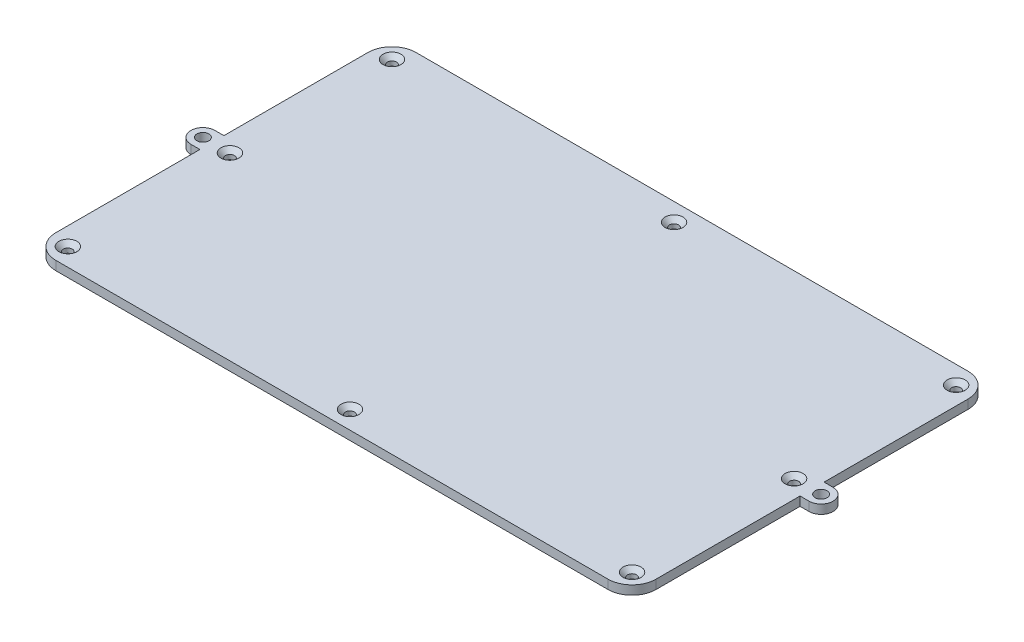
ISO-10303-21;
HEADER;
FILE_DESCRIPTION(('STEP AP214'),'2;1');
FILE_NAME('part.step','',(''),(''),'','','');
FILE_SCHEMA(('AUTOMOTIVE_DESIGN { 1 0 10303 214 1 1 1 1 }'));
ENDSEC;
DATA;
#1=APPLICATION_CONTEXT('core data for automotive mechanical design processes');
#2=APPLICATION_PROTOCOL_DEFINITION('international standard','automotive_design',2000,#1);
#3=PRODUCT_CONTEXT('',#1,'mechanical');
#4=PRODUCT('Part','Part','',(#3));
#5=PRODUCT_RELATED_PRODUCT_CATEGORY('part','',(#4));
#6=PRODUCT_DEFINITION_FORMATION('','',#4);
#7=PRODUCT_DEFINITION_CONTEXT('part definition',#1,'design');
#8=PRODUCT_DEFINITION('design','',#6,#7);
#9=PRODUCT_DEFINITION_SHAPE('','',#8);
#10=(LENGTH_UNIT() NAMED_UNIT(*) SI_UNIT(.MILLI.,.METRE.));
#11=(NAMED_UNIT(*) PLANE_ANGLE_UNIT() SI_UNIT($,.RADIAN.));
#12=(NAMED_UNIT(*) SI_UNIT($,.STERADIAN.) SOLID_ANGLE_UNIT());
#13=UNCERTAINTY_MEASURE_WITH_UNIT(LENGTH_MEASURE(1.E-05),#10,'distance_accuracy_value','');
#14=(GEOMETRIC_REPRESENTATION_CONTEXT(3) GLOBAL_UNCERTAINTY_ASSIGNED_CONTEXT((#13)) GLOBAL_UNIT_ASSIGNED_CONTEXT((#10,
#11,#12)) REPRESENTATION_CONTEXT('',''));
#15=CARTESIAN_POINT('',(0.,0.,0.));
#16=DIRECTION('',(0.,0.,1.));
#17=DIRECTION('',(1.,0.,0.));
#18=AXIS2_PLACEMENT_3D('',#15,#16,#17);
#19=CARTESIAN_POINT('',(-100.,3.,60.));
#20=DIRECTION('',(1.,0.,0.));
#21=DIRECTION('',(0.,0.,-1.));
#22=AXIS2_PLACEMENT_3D('',#19,#20,#21);
#23=PLANE('',#22);
#24=DIRECTION('',(0.,0.,1.));
#25=VECTOR('',#24,1.);
#26=CARTESIAN_POINT('',(-100.,0.,60.));
#27=LINE('',#26,#25);
#28=CARTESIAN_POINT('',(-100.,0.,-52.));
#29=VERTEX_POINT('',#28);
#30=CARTESIAN_POINT('',(-100.,0.,-3.99999999999996));
#31=VERTEX_POINT('',#30);
#32=EDGE_CURVE('E306',#29,#31,#27,.T.);
#33=ORIENTED_EDGE('',*,*,#32,.T.);
#34=DIRECTION('',(0.,-1.,0.));
#35=VECTOR('',#34,1.);
#36=CARTESIAN_POINT('',(-100.,3.,-3.99999999999996));
#37=LINE('',#36,#35);
#38=CARTESIAN_POINT('',(-100.,3.,-3.99999999999996));
#39=VERTEX_POINT('',#38);
#40=EDGE_CURVE('E57',#39,#31,#37,.T.);
#41=ORIENTED_EDGE('',*,*,#40,.F.);
#42=DIRECTION('',(0.,0.,1.));
#43=VECTOR('',#42,1.);
#44=CARTESIAN_POINT('',(-100.,3.,60.));
#45=LINE('',#44,#43);
#46=CARTESIAN_POINT('',(-100.,3.,-52.));
#47=VERTEX_POINT('',#46);
#48=EDGE_CURVE('E294',#47,#39,#45,.T.);
#49=ORIENTED_EDGE('',*,*,#48,.F.);
#50=DIRECTION('',(0.,-1.,0.));
#51=VECTOR('',#50,1.);
#52=CARTESIAN_POINT('',(-100.,3.,-52.));
#53=LINE('',#52,#51);
#54=EDGE_CURVE('E325',#47,#29,#53,.T.);
#55=ORIENTED_EDGE('',*,*,#54,.T.);
#56=EDGE_LOOP('',(#33,#41,#49,#55));
#57=FACE_BOUND('',#56,.T.);
#58=ADVANCED_FACE('F32',(#57),#23,.F.);
#59=CARTESIAN_POINT('',(100.,3.,60.));
#60=DIRECTION('',(-1.,0.,0.));
#61=DIRECTION('',(0.,0.,1.));
#62=AXIS2_PLACEMENT_3D('',#59,#60,#61);
#63=PLANE('',#62);
#64=DIRECTION('',(0.,0.,-1.));
#65=VECTOR('',#64,1.);
#66=CARTESIAN_POINT('',(100.,0.,60.));
#67=LINE('',#66,#65);
#68=CARTESIAN_POINT('',(100.,0.,52.));
#69=VERTEX_POINT('',#68);
#70=CARTESIAN_POINT('',(100.,0.,4.));
#71=VERTEX_POINT('',#70);
#72=EDGE_CURVE('E300',#69,#71,#67,.T.);
#73=ORIENTED_EDGE('',*,*,#72,.T.);
#74=DIRECTION('',(0.,-1.,0.));
#75=VECTOR('',#74,1.);
#76=CARTESIAN_POINT('',(100.,3.,4.));
#77=LINE('',#76,#75);
#78=CARTESIAN_POINT('',(100.,3.,4.));
#79=VERTEX_POINT('',#78);
#80=EDGE_CURVE('E205',#79,#71,#77,.T.);
#81=ORIENTED_EDGE('',*,*,#80,.F.);
#82=DIRECTION('',(0.,0.,-1.));
#83=VECTOR('',#82,1.);
#84=CARTESIAN_POINT('',(100.,3.,60.));
#85=LINE('',#84,#83);
#86=CARTESIAN_POINT('',(100.,3.,52.));
#87=VERTEX_POINT('',#86);
#88=EDGE_CURVE('E287',#87,#79,#85,.T.);
#89=ORIENTED_EDGE('',*,*,#88,.F.);
#90=DIRECTION('',(0.,-1.,0.));
#91=VECTOR('',#90,1.);
#92=CARTESIAN_POINT('',(100.,3.,52.));
#93=LINE('',#92,#91);
#94=EDGE_CURVE('E11',#87,#69,#93,.T.);
#95=ORIENTED_EDGE('',*,*,#94,.T.);
#96=EDGE_LOOP('',(#73,#81,#89,#95));
#97=FACE_BOUND('',#96,.T.);
#98=ADVANCED_FACE('F397',(#97),#63,.F.);
#99=CARTESIAN_POINT('',(100.,3.,-4.));
#100=VERTEX_POINT('',#99);
#101=CARTESIAN_POINT('',(100.,3.,-52.));
#102=VERTEX_POINT('',#101);
#103=EDGE_CURVE('E291',#100,#102,#85,.T.);
#104=ORIENTED_EDGE('',*,*,#103,.F.);
#105=DIRECTION('',(0.,-1.,0.));
#106=VECTOR('',#105,1.);
#107=CARTESIAN_POINT('',(100.,3.,-4.));
#108=LINE('',#107,#106);
#109=CARTESIAN_POINT('',(100.,0.,-4.));
#110=VERTEX_POINT('',#109);
#111=EDGE_CURVE('E197',#100,#110,#108,.T.);
#112=ORIENTED_EDGE('',*,*,#111,.T.);
#113=CARTESIAN_POINT('',(100.,0.,-52.));
#114=VERTEX_POINT('',#113);
#115=EDGE_CURVE('E286',#110,#114,#67,.T.);
#116=ORIENTED_EDGE('',*,*,#115,.T.);
#117=DIRECTION('',(0.,-1.,0.));
#118=VECTOR('',#117,1.);
#119=CARTESIAN_POINT('',(100.,3.,-52.));
#120=LINE('',#119,#118);
#121=EDGE_CURVE('E41',#114,#102,#120,.F.);
#122=ORIENTED_EDGE('',*,*,#121,.T.);
#123=EDGE_LOOP('',(#104,#112,#116,#122));
#124=FACE_BOUND('',#123,.T.);
#125=ADVANCED_FACE('F403',(#124),#63,.F.);
#126=CARTESIAN_POINT('',(-100.,3.,-60.));
#127=DIRECTION('',(0.,0.,1.));
#128=DIRECTION('',(1.,0.,0.));
#129=AXIS2_PLACEMENT_3D('',#126,#127,#128);
#130=PLANE('',#129);
#131=DIRECTION('',(-1.,0.,0.));
#132=VECTOR('',#131,1.);
#133=CARTESIAN_POINT('',(-100.,0.,-60.));
#134=LINE('',#133,#132);
#135=CARTESIAN_POINT('',(92.,0.,-60.));
#136=VERTEX_POINT('',#135);
#137=CARTESIAN_POINT('',(-92.,0.,-60.));
#138=VERTEX_POINT('',#137);
#139=EDGE_CURVE('E302',#136,#138,#134,.T.);
#140=ORIENTED_EDGE('',*,*,#139,.T.);
#141=DIRECTION('',(0.,-1.,0.));
#142=VECTOR('',#141,1.);
#143=CARTESIAN_POINT('',(-92.,3.,-60.));
#144=LINE('',#143,#142);
#145=CARTESIAN_POINT('',(-92.,3.,-60.));
#146=VERTEX_POINT('',#145);
#147=EDGE_CURVE('E341',#138,#146,#144,.F.);
#148=ORIENTED_EDGE('',*,*,#147,.T.);
#149=DIRECTION('',(-1.,0.,0.));
#150=VECTOR('',#149,1.);
#151=CARTESIAN_POINT('',(-100.,3.,-60.));
#152=LINE('',#151,#150);
#153=CARTESIAN_POINT('',(92.,3.,-60.));
#154=VERTEX_POINT('',#153);
#155=EDGE_CURVE('E290',#154,#146,#152,.T.);
#156=ORIENTED_EDGE('',*,*,#155,.F.);
#157=DIRECTION('',(0.,-1.,0.));
#158=VECTOR('',#157,1.);
#159=CARTESIAN_POINT('',(92.,3.,-60.));
#160=LINE('',#159,#158);
#161=EDGE_CURVE('E338',#154,#136,#160,.T.);
#162=ORIENTED_EDGE('',*,*,#161,.T.);
#163=EDGE_LOOP('',(#140,#148,#156,#162));
#164=FACE_BOUND('',#163,.T.);
#165=ADVANCED_FACE('F409',(#164),#130,.F.);
#166=CARTESIAN_POINT('',(-100.,3.,3.99999999999996));
#167=VERTEX_POINT('',#166);
#168=CARTESIAN_POINT('',(-100.,3.,52.));
#169=VERTEX_POINT('',#168);
#170=EDGE_CURVE('E49',#167,#169,#45,.T.);
#171=ORIENTED_EDGE('',*,*,#170,.F.);
#172=DIRECTION('',(0.,-1.,0.));
#173=VECTOR('',#172,1.);
#174=CARTESIAN_POINT('',(-100.,3.,3.99999999999996));
#175=LINE('',#174,#173);
#176=CARTESIAN_POINT('',(-100.,0.,3.99999999999996));
#177=VERTEX_POINT('',#176);
#178=EDGE_CURVE('E161',#167,#177,#175,.T.);
#179=ORIENTED_EDGE('',*,*,#178,.T.);
#180=CARTESIAN_POINT('',(-100.,0.,52.));
#181=VERTEX_POINT('',#180);
#182=EDGE_CURVE('E305',#177,#181,#27,.T.);
#183=ORIENTED_EDGE('',*,*,#182,.T.);
#184=DIRECTION('',(0.,-1.,0.));
#185=VECTOR('',#184,1.);
#186=CARTESIAN_POINT('',(-100.,3.,52.));
#187=LINE('',#186,#185);
#188=EDGE_CURVE('E328',#181,#169,#187,.F.);
#189=ORIENTED_EDGE('',*,*,#188,.T.);
#190=EDGE_LOOP('',(#171,#179,#183,#189));
#191=FACE_BOUND('',#190,.T.);
#192=ADVANCED_FACE('F399',(#191),#23,.F.);
#193=CARTESIAN_POINT('',(-100.,3.,60.));
#194=DIRECTION('',(0.,0.,-1.));
#195=DIRECTION('',(-1.,0.,0.));
#196=AXIS2_PLACEMENT_3D('',#193,#194,#195);
#197=PLANE('',#196);
#198=DIRECTION('',(1.,0.,0.));
#199=VECTOR('',#198,1.);
#200=CARTESIAN_POINT('',(-100.,3.,60.));
#201=LINE('',#200,#199);
#202=CARTESIAN_POINT('',(-92.,3.,60.));
#203=VERTEX_POINT('',#202);
#204=CARTESIAN_POINT('',(92.,3.,60.));
#205=VERTEX_POINT('',#204);
#206=EDGE_CURVE('E296',#203,#205,#201,.T.);
#207=ORIENTED_EDGE('',*,*,#206,.F.);
#208=DIRECTION('',(0.,-1.,0.));
#209=VECTOR('',#208,1.);
#210=CARTESIAN_POINT('',(-92.,3.,60.));
#211=LINE('',#210,#209);
#212=CARTESIAN_POINT('',(-92.,0.,60.));
#213=VERTEX_POINT('',#212);
#214=EDGE_CURVE('E312',#203,#213,#211,.T.);
#215=ORIENTED_EDGE('',*,*,#214,.T.);
#216=DIRECTION('',(1.,0.,0.));
#217=VECTOR('',#216,1.);
#218=CARTESIAN_POINT('',(-100.,0.,60.));
#219=LINE('',#218,#217);
#220=CARTESIAN_POINT('',(92.,0.,60.));
#221=VERTEX_POINT('',#220);
#222=EDGE_CURVE('E308',#213,#221,#219,.T.);
#223=ORIENTED_EDGE('',*,*,#222,.T.);
#224=DIRECTION('',(0.,-1.,0.));
#225=VECTOR('',#224,1.);
#226=CARTESIAN_POINT('',(92.,3.,60.));
#227=LINE('',#226,#225);
#228=EDGE_CURVE('E299',#221,#205,#227,.F.);
#229=ORIENTED_EDGE('',*,*,#228,.T.);
#230=EDGE_LOOP('',(#207,#215,#223,#229));
#231=FACE_BOUND('',#230,.T.);
#232=ADVANCED_FACE('F361',(#231),#197,.F.);
#233=CARTESIAN_POINT('',(0.,3.,0.));
#234=DIRECTION('',(0.,-1.,0.));
#235=DIRECTION('',(0.,0.,-1.));
#236=AXIS2_PLACEMENT_3D('',#233,#234,#235);
#237=PLANE('',#236);
#238=CARTESIAN_POINT('',(-103.,3.,0.));
#239=DIRECTION('',(0.,1.,0.));
#240=DIRECTION('',(0.,0.,1.));
#241=AXIS2_PLACEMENT_3D('',#238,#239,#240);
#242=CIRCLE('',#241,2.);
#243=CARTESIAN_POINT('',(-103.,3.,2.));
#244=VERTEX_POINT('',#243);
#245=EDGE_CURVE('E346',#244,#244,#242,.T.);
#246=ORIENTED_EDGE('',*,*,#245,.F.);
#247=EDGE_LOOP('',(#246));
#248=FACE_BOUND('',#247,.T.);
#249=CARTESIAN_POINT('',(103.,3.,0.));
#250=DIRECTION('',(0.,1.,0.));
#251=DIRECTION('',(0.,0.,1.));
#252=AXIS2_PLACEMENT_3D('',#249,#250,#251);
#253=CIRCLE('',#252,2.);
#254=CARTESIAN_POINT('',(103.,3.,1.99999999999999));
#255=VERTEX_POINT('',#254);
#256=EDGE_CURVE('E176',#255,#255,#253,.T.);
#257=ORIENTED_EDGE('',*,*,#256,.F.);
#258=EDGE_LOOP('',(#257));
#259=FACE_BOUND('',#258,.T.);
#260=CARTESIAN_POINT('',(-94.,3.,-54.));
#261=DIRECTION('',(0.,1.,0.));
#262=DIRECTION('',(0.,0.,1.));
#263=AXIS2_PLACEMENT_3D('',#260,#261,#262);
#264=CIRCLE('',#263,3.);
#265=CARTESIAN_POINT('',(-94.,3.,-51.));
#266=VERTEX_POINT('',#265);
#267=EDGE_CURVE('E208',#266,#266,#264,.T.);
#268=ORIENTED_EDGE('',*,*,#267,.F.);
#269=EDGE_LOOP('',(#268));
#270=FACE_BOUND('',#269,.T.);
#271=CARTESIAN_POINT('',(0.,3.,-54.));
#272=DIRECTION('',(0.,1.,0.));
#273=DIRECTION('',(0.,0.,1.));
#274=AXIS2_PLACEMENT_3D('',#271,#272,#273);
#275=CIRCLE('',#274,3.);
#276=CARTESIAN_POINT('',(0.,3.,-51.));
#277=VERTEX_POINT('',#276);
#278=EDGE_CURVE('E223',#277,#277,#275,.T.);
#279=ORIENTED_EDGE('',*,*,#278,.F.);
#280=EDGE_LOOP('',(#279));
#281=FACE_BOUND('',#280,.T.);
#282=CARTESIAN_POINT('',(94.,3.,-54.));
#283=DIRECTION('',(0.,1.,0.));
#284=DIRECTION('',(0.,0.,1.));
#285=AXIS2_PLACEMENT_3D('',#282,#283,#284);
#286=CIRCLE('',#285,3.);
#287=CARTESIAN_POINT('',(94.,3.,-51.));
#288=VERTEX_POINT('',#287);
#289=EDGE_CURVE('E232',#288,#288,#286,.T.);
#290=ORIENTED_EDGE('',*,*,#289,.F.);
#291=EDGE_LOOP('',(#290));
#292=FACE_BOUND('',#291,.T.);
#293=CARTESIAN_POINT('',(94.,3.,0.));
#294=DIRECTION('',(0.,1.,0.));
#295=DIRECTION('',(0.,0.,1.));
#296=AXIS2_PLACEMENT_3D('',#293,#294,#295);
#297=CIRCLE('',#296,3.);
#298=CARTESIAN_POINT('',(94.,3.,3.));
#299=VERTEX_POINT('',#298);
#300=EDGE_CURVE('E241',#299,#299,#297,.T.);
#301=ORIENTED_EDGE('',*,*,#300,.F.);
#302=EDGE_LOOP('',(#301));
#303=FACE_BOUND('',#302,.T.);
#304=CARTESIAN_POINT('',(94.,3.,54.));
#305=DIRECTION('',(0.,1.,0.));
#306=DIRECTION('',(0.,0.,1.));
#307=AXIS2_PLACEMENT_3D('',#304,#305,#306);
#308=CIRCLE('',#307,3.);
#309=CARTESIAN_POINT('',(94.,3.,57.));
#310=VERTEX_POINT('',#309);
#311=EDGE_CURVE('E250',#310,#310,#308,.T.);
#312=ORIENTED_EDGE('',*,*,#311,.F.);
#313=EDGE_LOOP('',(#312));
#314=FACE_BOUND('',#313,.T.);
#315=CARTESIAN_POINT('',(0.,3.,54.));
#316=DIRECTION('',(0.,1.,0.));
#317=DIRECTION('',(0.,0.,1.));
#318=AXIS2_PLACEMENT_3D('',#315,#316,#317);
#319=CIRCLE('',#318,3.);
#320=CARTESIAN_POINT('',(0.,3.,57.));
#321=VERTEX_POINT('',#320);
#322=EDGE_CURVE('E259',#321,#321,#319,.T.);
#323=ORIENTED_EDGE('',*,*,#322,.F.);
#324=EDGE_LOOP('',(#323));
#325=FACE_BOUND('',#324,.T.);
#326=CARTESIAN_POINT('',(-94.,3.,54.));
#327=DIRECTION('',(0.,1.,0.));
#328=DIRECTION('',(0.,0.,1.));
#329=AXIS2_PLACEMENT_3D('',#326,#327,#328);
#330=CIRCLE('',#329,3.);
#331=CARTESIAN_POINT('',(-94.,3.,57.));
#332=VERTEX_POINT('',#331);
#333=EDGE_CURVE('E268',#332,#332,#330,.T.);
#334=ORIENTED_EDGE('',*,*,#333,.F.);
#335=EDGE_LOOP('',(#334));
#336=FACE_BOUND('',#335,.T.);
#337=CARTESIAN_POINT('',(-94.,3.,0.));
#338=DIRECTION('',(0.,1.,0.));
#339=DIRECTION('',(0.,0.,1.));
#340=AXIS2_PLACEMENT_3D('',#337,#338,#339);
#341=CIRCLE('',#340,3.);
#342=CARTESIAN_POINT('',(-94.,3.,3.));
#343=VERTEX_POINT('',#342);
#344=EDGE_CURVE('E277',#343,#343,#341,.T.);
#345=ORIENTED_EDGE('',*,*,#344,.F.);
#346=EDGE_LOOP('',(#345));
#347=FACE_BOUND('',#346,.T.);
#348=ORIENTED_EDGE('',*,*,#48,.T.);
#349=DIRECTION('',(1.,0.,0.));
#350=VECTOR('',#349,1.);
#351=CARTESIAN_POINT('',(-100.,3.,-3.99999999999996));
#352=LINE('',#351,#350);
#353=CARTESIAN_POINT('',(-103.,3.,-3.99999999999996));
#354=VERTEX_POINT('',#353);
#355=EDGE_CURVE('E168',#354,#39,#352,.T.);
#356=ORIENTED_EDGE('',*,*,#355,.F.);
#357=CARTESIAN_POINT('',(-103.,3.,0.));
#358=DIRECTION('',(0.,-1.,0.));
#359=DIRECTION('',(0.,0.,1.));
#360=AXIS2_PLACEMENT_3D('',#357,#358,#359);
#361=CIRCLE('',#360,3.99999999999996);
#362=CARTESIAN_POINT('',(-103.,3.,3.99999999999996));
#363=VERTEX_POINT('',#362);
#364=EDGE_CURVE('E152',#363,#354,#361,.T.);
#365=ORIENTED_EDGE('',*,*,#364,.F.);
#366=DIRECTION('',(-1.,0.,0.));
#367=VECTOR('',#366,1.);
#368=CARTESIAN_POINT('',(-103.,3.,3.99999999999996));
#369=LINE('',#368,#367);
#370=EDGE_CURVE('E166',#167,#363,#369,.T.);
#371=ORIENTED_EDGE('',*,*,#370,.F.);
#372=ORIENTED_EDGE('',*,*,#170,.T.);
#373=CARTESIAN_POINT('',(-92.,3.,52.));
#374=DIRECTION('',(0.,-1.,0.));
#375=DIRECTION('',(0.,0.,-1.));
#376=AXIS2_PLACEMENT_3D('',#373,#374,#375);
#377=CIRCLE('',#376,8.);
#378=EDGE_CURVE('E336',#169,#203,#377,.F.);
#379=ORIENTED_EDGE('',*,*,#378,.T.);
#380=ORIENTED_EDGE('',*,*,#206,.T.);
#381=CARTESIAN_POINT('',(92.,3.,52.));
#382=DIRECTION('',(0.,-1.,0.));
#383=DIRECTION('',(0.,0.,-1.));
#384=AXIS2_PLACEMENT_3D('',#381,#382,#383);
#385=CIRCLE('',#384,8.);
#386=EDGE_CURVE('E332',#205,#87,#385,.F.);
#387=ORIENTED_EDGE('',*,*,#386,.T.);
#388=ORIENTED_EDGE('',*,*,#88,.T.);
#389=DIRECTION('',(-1.,0.,0.));
#390=VECTOR('',#389,1.);
#391=CARTESIAN_POINT('',(100.,3.,4.));
#392=LINE('',#391,#390);
#393=CARTESIAN_POINT('',(103.,3.,4.));
#394=VERTEX_POINT('',#393);
#395=EDGE_CURVE('E194',#394,#79,#392,.T.);
#396=ORIENTED_EDGE('',*,*,#395,.F.);
#397=CARTESIAN_POINT('',(103.,3.,0.));
#398=DIRECTION('',(0.,-1.,0.));
#399=DIRECTION('',(0.,0.,1.));
#400=AXIS2_PLACEMENT_3D('',#397,#398,#399);
#401=CIRCLE('',#400,4.);
#402=CARTESIAN_POINT('',(103.,3.,-4.));
#403=VERTEX_POINT('',#402);
#404=EDGE_CURVE('E190',#403,#394,#401,.T.);
#405=ORIENTED_EDGE('',*,*,#404,.F.);
#406=DIRECTION('',(1.,0.,0.));
#407=VECTOR('',#406,1.);
#408=CARTESIAN_POINT('',(103.,3.,-4.));
#409=LINE('',#408,#407);
#410=EDGE_CURVE('E187',#100,#403,#409,.T.);
#411=ORIENTED_EDGE('',*,*,#410,.F.);
#412=ORIENTED_EDGE('',*,*,#103,.T.);
#413=CARTESIAN_POINT('',(92.,3.,-52.));
#414=DIRECTION('',(0.,-1.,0.));
#415=DIRECTION('',(0.,0.,-1.));
#416=AXIS2_PLACEMENT_3D('',#413,#414,#415);
#417=CIRCLE('',#416,8.);
#418=EDGE_CURVE('E330',#102,#154,#417,.F.);
#419=ORIENTED_EDGE('',*,*,#418,.T.);
#420=ORIENTED_EDGE('',*,*,#155,.T.);
#421=CARTESIAN_POINT('',(-92.,3.,-52.));
#422=DIRECTION('',(0.,-1.,0.));
#423=DIRECTION('',(0.,0.,-1.));
#424=AXIS2_PLACEMENT_3D('',#421,#422,#423);
#425=CIRCLE('',#424,8.);
#426=EDGE_CURVE('E334',#146,#47,#425,.F.);
#427=ORIENTED_EDGE('',*,*,#426,.T.);
#428=EDGE_LOOP('',(#348,#356,#365,#371,#372,#379,#380,#387,#388,#396,#405,#411,#412,#419,#420,#427));
#429=FACE_BOUND('',#428,.T.);
#430=ADVANCED_FACE('F165',(#248,#259,#270,#281,#292,#303,#314,#325,#336,#347,#429),#237,.F.);
#431=CARTESIAN_POINT('',(0.,0.,0.));
#432=DIRECTION('',(0.,-1.,0.));
#433=DIRECTION('',(0.,0.,-1.));
#434=AXIS2_PLACEMENT_3D('',#431,#432,#433);
#435=PLANE('',#434);
#436=CARTESIAN_POINT('',(-103.,0.,0.));
#437=DIRECTION('',(0.,-1.,0.));
#438=DIRECTION('',(0.,0.,-1.));
#439=AXIS2_PLACEMENT_3D('',#436,#437,#438);
#440=CIRCLE('',#439,2.);
#441=CARTESIAN_POINT('',(-103.,0.,-2.));
#442=VERTEX_POINT('',#441);
#443=EDGE_CURVE('E36',#442,#442,#440,.T.);
#444=ORIENTED_EDGE('',*,*,#443,.F.);
#445=EDGE_LOOP('',(#444));
#446=FACE_BOUND('',#445,.T.);
#447=CARTESIAN_POINT('',(103.,0.,0.));
#448=DIRECTION('',(0.,-1.,0.));
#449=DIRECTION('',(0.,0.,-1.));
#450=AXIS2_PLACEMENT_3D('',#447,#448,#449);
#451=CIRCLE('',#450,2.);
#452=CARTESIAN_POINT('',(103.,0.,-2.));
#453=VERTEX_POINT('',#452);
#454=EDGE_CURVE('E344',#453,#453,#451,.T.);
#455=ORIENTED_EDGE('',*,*,#454,.F.);
#456=EDGE_LOOP('',(#455));
#457=FACE_BOUND('',#456,.T.);
#458=CARTESIAN_POINT('',(-94.,0.,-54.));
#459=DIRECTION('',(0.,1.,0.));
#460=DIRECTION('',(0.,0.,1.));
#461=AXIS2_PLACEMENT_3D('',#458,#459,#460);
#462=CIRCLE('',#461,1.5);
#463=CARTESIAN_POINT('',(-94.,0.,-52.5));
#464=VERTEX_POINT('',#463);
#465=EDGE_CURVE('E220',#464,#464,#462,.T.);
#466=ORIENTED_EDGE('',*,*,#465,.T.);
#467=EDGE_LOOP('',(#466));
#468=FACE_BOUND('',#467,.T.);
#469=CARTESIAN_POINT('',(0.,0.,-54.));
#470=DIRECTION('',(0.,1.,0.));
#471=DIRECTION('',(0.,0.,1.));
#472=AXIS2_PLACEMENT_3D('',#469,#470,#471);
#473=CIRCLE('',#472,1.5);
#474=CARTESIAN_POINT('',(0.,0.,-52.5));
#475=VERTEX_POINT('',#474);
#476=EDGE_CURVE('E229',#475,#475,#473,.T.);
#477=ORIENTED_EDGE('',*,*,#476,.T.);
#478=EDGE_LOOP('',(#477));
#479=FACE_BOUND('',#478,.T.);
#480=CARTESIAN_POINT('',(94.,0.,-54.));
#481=DIRECTION('',(0.,1.,0.));
#482=DIRECTION('',(0.,0.,1.));
#483=AXIS2_PLACEMENT_3D('',#480,#481,#482);
#484=CIRCLE('',#483,1.5);
#485=CARTESIAN_POINT('',(94.,0.,-52.5));
#486=VERTEX_POINT('',#485);
#487=EDGE_CURVE('E238',#486,#486,#484,.T.);
#488=ORIENTED_EDGE('',*,*,#487,.T.);
#489=EDGE_LOOP('',(#488));
#490=FACE_BOUND('',#489,.T.);
#491=CARTESIAN_POINT('',(94.,0.,0.));
#492=DIRECTION('',(0.,1.,0.));
#493=DIRECTION('',(0.,0.,1.));
#494=AXIS2_PLACEMENT_3D('',#491,#492,#493);
#495=CIRCLE('',#494,1.5);
#496=CARTESIAN_POINT('',(94.,0.,1.5));
#497=VERTEX_POINT('',#496);
#498=EDGE_CURVE('E247',#497,#497,#495,.T.);
#499=ORIENTED_EDGE('',*,*,#498,.T.);
#500=EDGE_LOOP('',(#499));
#501=FACE_BOUND('',#500,.T.);
#502=CARTESIAN_POINT('',(94.,0.,54.));
#503=DIRECTION('',(0.,1.,0.));
#504=DIRECTION('',(0.,0.,1.));
#505=AXIS2_PLACEMENT_3D('',#502,#503,#504);
#506=CIRCLE('',#505,1.5);
#507=CARTESIAN_POINT('',(94.,0.,55.5));
#508=VERTEX_POINT('',#507);
#509=EDGE_CURVE('E256',#508,#508,#506,.T.);
#510=ORIENTED_EDGE('',*,*,#509,.T.);
#511=EDGE_LOOP('',(#510));
#512=FACE_BOUND('',#511,.T.);
#513=CARTESIAN_POINT('',(0.,0.,54.));
#514=DIRECTION('',(0.,1.,0.));
#515=DIRECTION('',(0.,0.,1.));
#516=AXIS2_PLACEMENT_3D('',#513,#514,#515);
#517=CIRCLE('',#516,1.5);
#518=CARTESIAN_POINT('',(0.,0.,55.5));
#519=VERTEX_POINT('',#518);
#520=EDGE_CURVE('E265',#519,#519,#517,.T.);
#521=ORIENTED_EDGE('',*,*,#520,.T.);
#522=EDGE_LOOP('',(#521));
#523=FACE_BOUND('',#522,.T.);
#524=CARTESIAN_POINT('',(-94.,0.,54.));
#525=DIRECTION('',(0.,1.,0.));
#526=DIRECTION('',(0.,0.,1.));
#527=AXIS2_PLACEMENT_3D('',#524,#525,#526);
#528=CIRCLE('',#527,1.5);
#529=CARTESIAN_POINT('',(-94.,0.,55.5));
#530=VERTEX_POINT('',#529);
#531=EDGE_CURVE('E274',#530,#530,#528,.T.);
#532=ORIENTED_EDGE('',*,*,#531,.T.);
#533=EDGE_LOOP('',(#532));
#534=FACE_BOUND('',#533,.T.);
#535=CARTESIAN_POINT('',(-94.,0.,0.));
#536=DIRECTION('',(0.,1.,0.));
#537=DIRECTION('',(0.,0.,1.));
#538=AXIS2_PLACEMENT_3D('',#535,#536,#537);
#539=CIRCLE('',#538,1.5);
#540=CARTESIAN_POINT('',(-94.,0.,1.5));
#541=VERTEX_POINT('',#540);
#542=EDGE_CURVE('E283',#541,#541,#539,.T.);
#543=ORIENTED_EDGE('',*,*,#542,.T.);
#544=EDGE_LOOP('',(#543));
#545=FACE_BOUND('',#544,.T.);
#546=ORIENTED_EDGE('',*,*,#222,.F.);
#547=CARTESIAN_POINT('',(-92.,0.,52.));
#548=DIRECTION('',(0.,-1.,0.));
#549=DIRECTION('',(0.,0.,-1.));
#550=AXIS2_PLACEMENT_3D('',#547,#548,#549);
#551=CIRCLE('',#550,8.);
#552=EDGE_CURVE('E322',#213,#181,#551,.T.);
#553=ORIENTED_EDGE('',*,*,#552,.T.);
#554=ORIENTED_EDGE('',*,*,#182,.F.);
#555=DIRECTION('',(-1.,0.,0.));
#556=VECTOR('',#555,1.);
#557=CARTESIAN_POINT('',(-103.,0.,3.99999999999996));
#558=LINE('',#557,#556);
#559=CARTESIAN_POINT('',(-103.,0.,3.99999999999996));
#560=VERTEX_POINT('',#559);
#561=EDGE_CURVE('E180',#177,#560,#558,.T.);
#562=ORIENTED_EDGE('',*,*,#561,.T.);
#563=CARTESIAN_POINT('',(-103.,0.,0.));
#564=DIRECTION('',(0.,-1.,0.));
#565=DIRECTION('',(0.,0.,1.));
#566=AXIS2_PLACEMENT_3D('',#563,#564,#565);
#567=CIRCLE('',#566,3.99999999999996);
#568=CARTESIAN_POINT('',(-103.,0.,-3.99999999999996));
#569=VERTEX_POINT('',#568);
#570=EDGE_CURVE('E155',#560,#569,#567,.T.);
#571=ORIENTED_EDGE('',*,*,#570,.T.);
#572=DIRECTION('',(1.,0.,0.));
#573=VECTOR('',#572,1.);
#574=CARTESIAN_POINT('',(-100.,0.,-3.99999999999996));
#575=LINE('',#574,#573);
#576=EDGE_CURVE('E171',#569,#31,#575,.T.);
#577=ORIENTED_EDGE('',*,*,#576,.T.);
#578=ORIENTED_EDGE('',*,*,#32,.F.);
#579=CARTESIAN_POINT('',(-92.,0.,-52.));
#580=DIRECTION('',(0.,-1.,0.));
#581=DIRECTION('',(0.,0.,-1.));
#582=AXIS2_PLACEMENT_3D('',#579,#580,#581);
#583=CIRCLE('',#582,8.);
#584=EDGE_CURVE('E320',#29,#138,#583,.T.);
#585=ORIENTED_EDGE('',*,*,#584,.T.);
#586=ORIENTED_EDGE('',*,*,#139,.F.);
#587=CARTESIAN_POINT('',(92.,0.,-52.));
#588=DIRECTION('',(0.,-1.,0.));
#589=DIRECTION('',(0.,0.,-1.));
#590=AXIS2_PLACEMENT_3D('',#587,#588,#589);
#591=CIRCLE('',#590,8.);
#592=EDGE_CURVE('E315',#136,#114,#591,.T.);
#593=ORIENTED_EDGE('',*,*,#592,.T.);
#594=ORIENTED_EDGE('',*,*,#115,.F.);
#595=DIRECTION('',(1.,0.,0.));
#596=VECTOR('',#595,1.);
#597=CARTESIAN_POINT('',(103.,0.,-4.));
#598=LINE('',#597,#596);
#599=CARTESIAN_POINT('',(103.,0.,-4.));
#600=VERTEX_POINT('',#599);
#601=EDGE_CURVE('E184',#110,#600,#598,.T.);
#602=ORIENTED_EDGE('',*,*,#601,.T.);
#603=CARTESIAN_POINT('',(103.,0.,0.));
#604=DIRECTION('',(0.,-1.,0.));
#605=DIRECTION('',(0.,0.,1.));
#606=AXIS2_PLACEMENT_3D('',#603,#604,#605);
#607=CIRCLE('',#606,4.);
#608=CARTESIAN_POINT('',(103.,0.,4.));
#609=VERTEX_POINT('',#608);
#610=EDGE_CURVE('E200',#600,#609,#607,.T.);
#611=ORIENTED_EDGE('',*,*,#610,.T.);
#612=DIRECTION('',(-1.,0.,0.));
#613=VECTOR('',#612,1.);
#614=CARTESIAN_POINT('',(100.,0.,4.));
#615=LINE('',#614,#613);
#616=EDGE_CURVE('E191',#609,#71,#615,.T.);
#617=ORIENTED_EDGE('',*,*,#616,.T.);
#618=ORIENTED_EDGE('',*,*,#72,.F.);
#619=CARTESIAN_POINT('',(92.,0.,52.));
#620=DIRECTION('',(0.,-1.,0.));
#621=DIRECTION('',(0.,0.,-1.));
#622=AXIS2_PLACEMENT_3D('',#619,#620,#621);
#623=CIRCLE('',#622,8.);
#624=EDGE_CURVE('E318',#69,#221,#623,.T.);
#625=ORIENTED_EDGE('',*,*,#624,.T.);
#626=EDGE_LOOP('',(#546,#553,#554,#562,#571,#577,#578,#585,#586,#593,#594,#602,#611,#617,#618,#625));
#627=FACE_BOUND('',#626,.T.);
#628=ADVANCED_FACE('F360',(#446,#457,#468,#479,#490,#501,#512,#523,#534,#545,#627),#435,.T.);
#629=CARTESIAN_POINT('',(-94.,3.,0.));
#630=DIRECTION('',(0.,1.,0.));
#631=DIRECTION('',(0.,0.,1.));
#632=AXIS2_PLACEMENT_3D('',#629,#630,#631);
#633=CYLINDRICAL_SURFACE('',#632,1.5);
#634=ORIENTED_EDGE('',*,*,#542,.F.);
#635=EDGE_LOOP('',(#634));
#636=FACE_BOUND('',#635,.T.);
#637=CARTESIAN_POINT('',(-94.,1.5,0.));
#638=DIRECTION('',(0.,1.,0.));
#639=DIRECTION('',(0.,0.,1.));
#640=AXIS2_PLACEMENT_3D('',#637,#638,#639);
#641=CIRCLE('',#640,1.5);
#642=CARTESIAN_POINT('',(-94.,1.5,1.5));
#643=VERTEX_POINT('',#642);
#644=EDGE_CURVE('E280',#643,#643,#641,.T.);
#645=ORIENTED_EDGE('',*,*,#644,.T.);
#646=EDGE_LOOP('',(#645));
#647=FACE_BOUND('',#646,.T.);
#648=ADVANCED_FACE('F383',(#636,#647),#633,.F.);
#649=CARTESIAN_POINT('',(-94.,3.,0.));
#650=DIRECTION('',(0.,1.,0.));
#651=DIRECTION('',(0.,0.,1.));
#652=AXIS2_PLACEMENT_3D('',#649,#650,#651);
#653=CONICAL_SURFACE('',#652,3.,0.785398163397449);
#654=ORIENTED_EDGE('',*,*,#644,.F.);
#655=EDGE_LOOP('',(#654));
#656=FACE_BOUND('',#655,.T.);
#657=ORIENTED_EDGE('',*,*,#344,.T.);
#658=EDGE_LOOP('',(#657));
#659=FACE_BOUND('',#658,.T.);
#660=ADVANCED_FACE('F380',(#656,#659),#653,.F.);
#661=CARTESIAN_POINT('',(-94.,3.,54.));
#662=DIRECTION('',(0.,1.,0.));
#663=DIRECTION('',(0.,0.,1.));
#664=AXIS2_PLACEMENT_3D('',#661,#662,#663);
#665=CYLINDRICAL_SURFACE('',#664,1.5);
#666=ORIENTED_EDGE('',*,*,#531,.F.);
#667=EDGE_LOOP('',(#666));
#668=FACE_BOUND('',#667,.T.);
#669=CARTESIAN_POINT('',(-94.,1.5,54.));
#670=DIRECTION('',(0.,1.,0.));
#671=DIRECTION('',(0.,0.,1.));
#672=AXIS2_PLACEMENT_3D('',#669,#670,#671);
#673=CIRCLE('',#672,1.5);
#674=CARTESIAN_POINT('',(-94.,1.5,55.5));
#675=VERTEX_POINT('',#674);
#676=EDGE_CURVE('E271',#675,#675,#673,.T.);
#677=ORIENTED_EDGE('',*,*,#676,.T.);
#678=EDGE_LOOP('',(#677));
#679=FACE_BOUND('',#678,.T.);
#680=ADVANCED_FACE('F382',(#668,#679),#665,.F.);
#681=CARTESIAN_POINT('',(-94.,3.,54.));
#682=DIRECTION('',(0.,1.,0.));
#683=DIRECTION('',(0.,0.,1.));
#684=AXIS2_PLACEMENT_3D('',#681,#682,#683);
#685=CONICAL_SURFACE('',#684,3.,0.785398163397449);
#686=ORIENTED_EDGE('',*,*,#676,.F.);
#687=EDGE_LOOP('',(#686));
#688=FACE_BOUND('',#687,.T.);
#689=ORIENTED_EDGE('',*,*,#333,.T.);
#690=EDGE_LOOP('',(#689));
#691=FACE_BOUND('',#690,.T.);
#692=ADVANCED_FACE('F390',(#688,#691),#685,.F.);
#693=CARTESIAN_POINT('',(0.,3.,54.));
#694=DIRECTION('',(0.,1.,0.));
#695=DIRECTION('',(0.,0.,1.));
#696=AXIS2_PLACEMENT_3D('',#693,#694,#695);
#697=CYLINDRICAL_SURFACE('',#696,1.5);
#698=ORIENTED_EDGE('',*,*,#520,.F.);
#699=EDGE_LOOP('',(#698));
#700=FACE_BOUND('',#699,.T.);
#701=CARTESIAN_POINT('',(0.,1.5,54.));
#702=DIRECTION('',(0.,1.,0.));
#703=DIRECTION('',(0.,0.,1.));
#704=AXIS2_PLACEMENT_3D('',#701,#702,#703);
#705=CIRCLE('',#704,1.5);
#706=CARTESIAN_POINT('',(0.,1.5,55.5));
#707=VERTEX_POINT('',#706);
#708=EDGE_CURVE('E262',#707,#707,#705,.T.);
#709=ORIENTED_EDGE('',*,*,#708,.T.);
#710=EDGE_LOOP('',(#709));
#711=FACE_BOUND('',#710,.T.);
#712=ADVANCED_FACE('F528',(#700,#711),#697,.F.);
#713=CARTESIAN_POINT('',(0.,3.,54.));
#714=DIRECTION('',(0.,1.,0.));
#715=DIRECTION('',(0.,0.,1.));
#716=AXIS2_PLACEMENT_3D('',#713,#714,#715);
#717=CONICAL_SURFACE('',#716,3.,0.785398163397449);
#718=ORIENTED_EDGE('',*,*,#708,.F.);
#719=EDGE_LOOP('',(#718));
#720=FACE_BOUND('',#719,.T.);
#721=ORIENTED_EDGE('',*,*,#322,.T.);
#722=EDGE_LOOP('',(#721));
#723=FACE_BOUND('',#722,.T.);
#724=ADVANCED_FACE('F524',(#720,#723),#717,.F.);
#725=CARTESIAN_POINT('',(94.,3.,54.));
#726=DIRECTION('',(0.,1.,0.));
#727=DIRECTION('',(0.,0.,1.));
#728=AXIS2_PLACEMENT_3D('',#725,#726,#727);
#729=CYLINDRICAL_SURFACE('',#728,1.5);
#730=ORIENTED_EDGE('',*,*,#509,.F.);
#731=EDGE_LOOP('',(#730));
#732=FACE_BOUND('',#731,.T.);
#733=CARTESIAN_POINT('',(94.,1.5,54.));
#734=DIRECTION('',(0.,1.,0.));
#735=DIRECTION('',(0.,0.,1.));
#736=AXIS2_PLACEMENT_3D('',#733,#734,#735);
#737=CIRCLE('',#736,1.5);
#738=CARTESIAN_POINT('',(94.,1.5,55.5));
#739=VERTEX_POINT('',#738);
#740=EDGE_CURVE('E253',#739,#739,#737,.T.);
#741=ORIENTED_EDGE('',*,*,#740,.T.);
#742=EDGE_LOOP('',(#741));
#743=FACE_BOUND('',#742,.T.);
#744=ADVANCED_FACE('F520',(#732,#743),#729,.F.);
#745=CARTESIAN_POINT('',(94.,3.,54.));
#746=DIRECTION('',(0.,1.,0.));
#747=DIRECTION('',(0.,0.,1.));
#748=AXIS2_PLACEMENT_3D('',#745,#746,#747);
#749=CONICAL_SURFACE('',#748,3.,0.785398163397449);
#750=ORIENTED_EDGE('',*,*,#740,.F.);
#751=EDGE_LOOP('',(#750));
#752=FACE_BOUND('',#751,.T.);
#753=ORIENTED_EDGE('',*,*,#311,.T.);
#754=EDGE_LOOP('',(#753));
#755=FACE_BOUND('',#754,.T.);
#756=ADVANCED_FACE('F516',(#752,#755),#749,.F.);
#757=CARTESIAN_POINT('',(94.,3.,0.));
#758=DIRECTION('',(0.,1.,0.));
#759=DIRECTION('',(0.,0.,1.));
#760=AXIS2_PLACEMENT_3D('',#757,#758,#759);
#761=CYLINDRICAL_SURFACE('',#760,1.5);
#762=ORIENTED_EDGE('',*,*,#498,.F.);
#763=EDGE_LOOP('',(#762));
#764=FACE_BOUND('',#763,.T.);
#765=CARTESIAN_POINT('',(94.,1.5,0.));
#766=DIRECTION('',(0.,1.,0.));
#767=DIRECTION('',(0.,0.,1.));
#768=AXIS2_PLACEMENT_3D('',#765,#766,#767);
#769=CIRCLE('',#768,1.5);
#770=CARTESIAN_POINT('',(94.,1.5,1.5));
#771=VERTEX_POINT('',#770);
#772=EDGE_CURVE('E244',#771,#771,#769,.T.);
#773=ORIENTED_EDGE('',*,*,#772,.T.);
#774=EDGE_LOOP('',(#773));
#775=FACE_BOUND('',#774,.T.);
#776=ADVANCED_FACE('F512',(#764,#775),#761,.F.);
#777=CARTESIAN_POINT('',(94.,3.,0.));
#778=DIRECTION('',(0.,1.,0.));
#779=DIRECTION('',(0.,0.,1.));
#780=AXIS2_PLACEMENT_3D('',#777,#778,#779);
#781=CONICAL_SURFACE('',#780,3.,0.785398163397449);
#782=ORIENTED_EDGE('',*,*,#772,.F.);
#783=EDGE_LOOP('',(#782));
#784=FACE_BOUND('',#783,.T.);
#785=ORIENTED_EDGE('',*,*,#300,.T.);
#786=EDGE_LOOP('',(#785));
#787=FACE_BOUND('',#786,.T.);
#788=ADVANCED_FACE('F508',(#784,#787),#781,.F.);
#789=CARTESIAN_POINT('',(94.,3.,-54.));
#790=DIRECTION('',(0.,1.,0.));
#791=DIRECTION('',(0.,0.,1.));
#792=AXIS2_PLACEMENT_3D('',#789,#790,#791);
#793=CYLINDRICAL_SURFACE('',#792,1.5);
#794=ORIENTED_EDGE('',*,*,#487,.F.);
#795=EDGE_LOOP('',(#794));
#796=FACE_BOUND('',#795,.T.);
#797=CARTESIAN_POINT('',(94.,1.5,-54.));
#798=DIRECTION('',(0.,1.,0.));
#799=DIRECTION('',(0.,0.,1.));
#800=AXIS2_PLACEMENT_3D('',#797,#798,#799);
#801=CIRCLE('',#800,1.5);
#802=CARTESIAN_POINT('',(94.,1.5,-52.5));
#803=VERTEX_POINT('',#802);
#804=EDGE_CURVE('E235',#803,#803,#801,.T.);
#805=ORIENTED_EDGE('',*,*,#804,.T.);
#806=EDGE_LOOP('',(#805));
#807=FACE_BOUND('',#806,.T.);
#808=ADVANCED_FACE('F504',(#796,#807),#793,.F.);
#809=CARTESIAN_POINT('',(94.,3.,-54.));
#810=DIRECTION('',(0.,1.,0.));
#811=DIRECTION('',(0.,0.,1.));
#812=AXIS2_PLACEMENT_3D('',#809,#810,#811);
#813=CONICAL_SURFACE('',#812,3.,0.785398163397449);
#814=ORIENTED_EDGE('',*,*,#804,.F.);
#815=EDGE_LOOP('',(#814));
#816=FACE_BOUND('',#815,.T.);
#817=ORIENTED_EDGE('',*,*,#289,.T.);
#818=EDGE_LOOP('',(#817));
#819=FACE_BOUND('',#818,.T.);
#820=ADVANCED_FACE('F500',(#816,#819),#813,.F.);
#821=CARTESIAN_POINT('',(0.,3.,-54.));
#822=DIRECTION('',(0.,1.,0.));
#823=DIRECTION('',(0.,0.,1.));
#824=AXIS2_PLACEMENT_3D('',#821,#822,#823);
#825=CYLINDRICAL_SURFACE('',#824,1.5);
#826=ORIENTED_EDGE('',*,*,#476,.F.);
#827=EDGE_LOOP('',(#826));
#828=FACE_BOUND('',#827,.T.);
#829=CARTESIAN_POINT('',(0.,1.5,-54.));
#830=DIRECTION('',(0.,1.,0.));
#831=DIRECTION('',(0.,0.,1.));
#832=AXIS2_PLACEMENT_3D('',#829,#830,#831);
#833=CIRCLE('',#832,1.5);
#834=CARTESIAN_POINT('',(0.,1.5,-52.5));
#835=VERTEX_POINT('',#834);
#836=EDGE_CURVE('E226',#835,#835,#833,.T.);
#837=ORIENTED_EDGE('',*,*,#836,.T.);
#838=EDGE_LOOP('',(#837));
#839=FACE_BOUND('',#838,.T.);
#840=ADVANCED_FACE('F496',(#828,#839),#825,.F.);
#841=CARTESIAN_POINT('',(0.,3.,-54.));
#842=DIRECTION('',(0.,1.,0.));
#843=DIRECTION('',(0.,0.,1.));
#844=AXIS2_PLACEMENT_3D('',#841,#842,#843);
#845=CONICAL_SURFACE('',#844,3.,0.785398163397449);
#846=ORIENTED_EDGE('',*,*,#836,.F.);
#847=EDGE_LOOP('',(#846));
#848=FACE_BOUND('',#847,.T.);
#849=ORIENTED_EDGE('',*,*,#278,.T.);
#850=EDGE_LOOP('',(#849));
#851=FACE_BOUND('',#850,.T.);
#852=ADVANCED_FACE('F492',(#848,#851),#845,.F.);
#853=CARTESIAN_POINT('',(-94.,3.,-54.));
#854=DIRECTION('',(0.,1.,0.));
#855=DIRECTION('',(0.,0.,1.));
#856=AXIS2_PLACEMENT_3D('',#853,#854,#855);
#857=CYLINDRICAL_SURFACE('',#856,1.5);
#858=ORIENTED_EDGE('',*,*,#465,.F.);
#859=EDGE_LOOP('',(#858));
#860=FACE_BOUND('',#859,.T.);
#861=CARTESIAN_POINT('',(-94.,1.5,-54.));
#862=DIRECTION('',(0.,1.,0.));
#863=DIRECTION('',(0.,0.,1.));
#864=AXIS2_PLACEMENT_3D('',#861,#862,#863);
#865=CIRCLE('',#864,1.5);
#866=CARTESIAN_POINT('',(-94.,1.5,-52.5));
#867=VERTEX_POINT('',#866);
#868=EDGE_CURVE('E217',#867,#867,#865,.T.);
#869=ORIENTED_EDGE('',*,*,#868,.T.);
#870=EDGE_LOOP('',(#869));
#871=FACE_BOUND('',#870,.T.);
#872=ADVANCED_FACE('F488',(#860,#871),#857,.F.);
#873=CARTESIAN_POINT('',(-94.,3.,-54.));
#874=DIRECTION('',(0.,1.,0.));
#875=DIRECTION('',(0.,0.,1.));
#876=AXIS2_PLACEMENT_3D('',#873,#874,#875);
#877=CONICAL_SURFACE('',#876,3.,0.785398163397449);
#878=ORIENTED_EDGE('',*,*,#868,.F.);
#879=EDGE_LOOP('',(#878));
#880=FACE_BOUND('',#879,.T.);
#881=ORIENTED_EDGE('',*,*,#267,.T.);
#882=EDGE_LOOP('',(#881));
#883=FACE_BOUND('',#882,.T.);
#884=ADVANCED_FACE('F425',(#880,#883),#877,.F.);
#885=CARTESIAN_POINT('',(-92.,3.,52.));
#886=DIRECTION('',(0.,-1.,0.));
#887=DIRECTION('',(0.,0.,-1.));
#888=AXIS2_PLACEMENT_3D('',#885,#886,#887);
#889=CYLINDRICAL_SURFACE('',#888,8.);
#890=ORIENTED_EDGE('',*,*,#378,.F.);
#891=ORIENTED_EDGE('',*,*,#188,.F.);
#892=ORIENTED_EDGE('',*,*,#552,.F.);
#893=ORIENTED_EDGE('',*,*,#214,.F.);
#894=EDGE_LOOP('',(#890,#891,#892,#893));
#895=FACE_BOUND('',#894,.T.);
#896=ADVANCED_FACE('F421',(#895),#889,.T.);
#897=CARTESIAN_POINT('',(-92.,3.,-52.));
#898=DIRECTION('',(0.,-1.,0.));
#899=DIRECTION('',(0.,0.,-1.));
#900=AXIS2_PLACEMENT_3D('',#897,#898,#899);
#901=CYLINDRICAL_SURFACE('',#900,8.);
#902=ORIENTED_EDGE('',*,*,#426,.F.);
#903=ORIENTED_EDGE('',*,*,#147,.F.);
#904=ORIENTED_EDGE('',*,*,#584,.F.);
#905=ORIENTED_EDGE('',*,*,#54,.F.);
#906=EDGE_LOOP('',(#902,#903,#904,#905));
#907=FACE_BOUND('',#906,.T.);
#908=ADVANCED_FACE('F424',(#907),#901,.T.);
#909=CARTESIAN_POINT('',(92.,3.,52.));
#910=DIRECTION('',(0.,-1.,0.));
#911=DIRECTION('',(0.,0.,-1.));
#912=AXIS2_PLACEMENT_3D('',#909,#910,#911);
#913=CYLINDRICAL_SURFACE('',#912,8.);
#914=ORIENTED_EDGE('',*,*,#386,.F.);
#915=ORIENTED_EDGE('',*,*,#228,.F.);
#916=ORIENTED_EDGE('',*,*,#624,.F.);
#917=ORIENTED_EDGE('',*,*,#94,.F.);
#918=EDGE_LOOP('',(#914,#915,#916,#917));
#919=FACE_BOUND('',#918,.T.);
#920=ADVANCED_FACE('F428',(#919),#913,.T.);
#921=CARTESIAN_POINT('',(92.,3.,-52.));
#922=DIRECTION('',(0.,-1.,0.));
#923=DIRECTION('',(0.,0.,-1.));
#924=AXIS2_PLACEMENT_3D('',#921,#922,#923);
#925=CYLINDRICAL_SURFACE('',#924,8.);
#926=ORIENTED_EDGE('',*,*,#418,.F.);
#927=ORIENTED_EDGE('',*,*,#121,.F.);
#928=ORIENTED_EDGE('',*,*,#592,.F.);
#929=ORIENTED_EDGE('',*,*,#161,.F.);
#930=EDGE_LOOP('',(#926,#927,#928,#929));
#931=FACE_BOUND('',#930,.T.);
#932=ADVANCED_FACE('F34',(#931),#925,.T.);
#933=CARTESIAN_POINT('',(100.,3.,4.));
#934=DIRECTION('',(0.,0.,1.));
#935=DIRECTION('',(1.,0.,0.));
#936=AXIS2_PLACEMENT_3D('',#933,#934,#935);
#937=PLANE('',#936);
#938=ORIENTED_EDGE('',*,*,#616,.F.);
#939=DIRECTION('',(0.,-1.,0.));
#940=VECTOR('',#939,1.);
#941=CARTESIAN_POINT('',(103.,3.,4.));
#942=LINE('',#941,#940);
#943=EDGE_CURVE('E209',#394,#609,#942,.T.);
#944=ORIENTED_EDGE('',*,*,#943,.F.);
#945=ORIENTED_EDGE('',*,*,#395,.T.);
#946=ORIENTED_EDGE('',*,*,#80,.T.);
#947=EDGE_LOOP('',(#938,#944,#945,#946));
#948=FACE_BOUND('',#947,.T.);
#949=ADVANCED_FACE('F435',(#948),#937,.T.);
#950=CARTESIAN_POINT('',(103.,3.,0.));
#951=DIRECTION('',(0.,-1.,0.));
#952=DIRECTION('',(0.,0.,-1.));
#953=AXIS2_PLACEMENT_3D('',#950,#951,#952);
#954=CYLINDRICAL_SURFACE('',#953,4.);
#955=ORIENTED_EDGE('',*,*,#610,.F.);
#956=DIRECTION('',(0.,-1.,0.));
#957=VECTOR('',#956,1.);
#958=CARTESIAN_POINT('',(103.,3.,-4.));
#959=LINE('',#958,#957);
#960=EDGE_CURVE('E211',#403,#600,#959,.T.);
#961=ORIENTED_EDGE('',*,*,#960,.F.);
#962=ORIENTED_EDGE('',*,*,#404,.T.);
#963=ORIENTED_EDGE('',*,*,#943,.T.);
#964=EDGE_LOOP('',(#955,#961,#962,#963));
#965=FACE_BOUND('',#964,.T.);
#966=ADVANCED_FACE('F451',(#965),#954,.T.);
#967=CARTESIAN_POINT('',(103.,3.,-4.));
#968=DIRECTION('',(0.,0.,-1.));
#969=DIRECTION('',(-1.,0.,0.));
#970=AXIS2_PLACEMENT_3D('',#967,#968,#969);
#971=PLANE('',#970);
#972=ORIENTED_EDGE('',*,*,#601,.F.);
#973=ORIENTED_EDGE('',*,*,#111,.F.);
#974=ORIENTED_EDGE('',*,*,#410,.T.);
#975=ORIENTED_EDGE('',*,*,#960,.T.);
#976=EDGE_LOOP('',(#972,#973,#974,#975));
#977=FACE_BOUND('',#976,.T.);
#978=ADVANCED_FACE('F456',(#977),#971,.T.);
#979=CARTESIAN_POINT('',(-100.,3.,-3.99999999999996));
#980=DIRECTION('',(0.,0.,-1.));
#981=DIRECTION('',(-1.,0.,0.));
#982=AXIS2_PLACEMENT_3D('',#979,#980,#981);
#983=PLANE('',#982);
#984=ORIENTED_EDGE('',*,*,#576,.F.);
#985=DIRECTION('',(0.,-1.,0.));
#986=VECTOR('',#985,1.);
#987=CARTESIAN_POINT('',(-103.,3.,-3.99999999999996));
#988=LINE('',#987,#986);
#989=EDGE_CURVE('E160',#354,#569,#988,.T.);
#990=ORIENTED_EDGE('',*,*,#989,.F.);
#991=ORIENTED_EDGE('',*,*,#355,.T.);
#992=ORIENTED_EDGE('',*,*,#40,.T.);
#993=EDGE_LOOP('',(#984,#990,#991,#992));
#994=FACE_BOUND('',#993,.T.);
#995=ADVANCED_FACE('F468',(#994),#983,.T.);
#996=CARTESIAN_POINT('',(-103.,3.,0.));
#997=DIRECTION('',(0.,-1.,0.));
#998=DIRECTION('',(0.,0.,-1.));
#999=AXIS2_PLACEMENT_3D('',#996,#997,#998);
#1000=CYLINDRICAL_SURFACE('',#999,3.99999999999996);
#1001=ORIENTED_EDGE('',*,*,#570,.F.);
#1002=DIRECTION('',(0.,-1.,0.));
#1003=VECTOR('',#1002,1.);
#1004=CARTESIAN_POINT('',(-103.,3.,3.99999999999996));
#1005=LINE('',#1004,#1003);
#1006=EDGE_CURVE('E149',#363,#560,#1005,.T.);
#1007=ORIENTED_EDGE('',*,*,#1006,.F.);
#1008=ORIENTED_EDGE('',*,*,#364,.T.);
#1009=ORIENTED_EDGE('',*,*,#989,.T.);
#1010=EDGE_LOOP('',(#1001,#1007,#1008,#1009));
#1011=FACE_BOUND('',#1010,.T.);
#1012=ADVANCED_FACE('F151',(#1011),#1000,.T.);
#1013=CARTESIAN_POINT('',(-103.,3.,3.99999999999996));
#1014=DIRECTION('',(0.,0.,1.));
#1015=DIRECTION('',(1.,0.,0.));
#1016=AXIS2_PLACEMENT_3D('',#1013,#1014,#1015);
#1017=PLANE('',#1016);
#1018=ORIENTED_EDGE('',*,*,#561,.F.);
#1019=ORIENTED_EDGE('',*,*,#178,.F.);
#1020=ORIENTED_EDGE('',*,*,#370,.T.);
#1021=ORIENTED_EDGE('',*,*,#1006,.T.);
#1022=EDGE_LOOP('',(#1018,#1019,#1020,#1021));
#1023=FACE_BOUND('',#1022,.T.);
#1024=ADVANCED_FACE('F170',(#1023),#1017,.T.);
#1025=CARTESIAN_POINT('',(103.,-1.,0.));
#1026=DIRECTION('',(0.,1.,0.));
#1027=DIRECTION('',(0.,0.,1.));
#1028=AXIS2_PLACEMENT_3D('',#1025,#1026,#1027);
#1029=CYLINDRICAL_SURFACE('',#1028,2.);
#1030=ORIENTED_EDGE('',*,*,#454,.T.);
#1031=EDGE_LOOP('',(#1030));
#1032=FACE_BOUND('',#1031,.T.);
#1033=ORIENTED_EDGE('',*,*,#256,.T.);
#1034=EDGE_LOOP('',(#1033));
#1035=FACE_BOUND('',#1034,.T.);
#1036=ADVANCED_FACE('F356',(#1032,#1035),#1029,.F.);
#1037=CARTESIAN_POINT('',(-103.,-1.,0.));
#1038=DIRECTION('',(0.,1.,0.));
#1039=DIRECTION('',(0.,0.,1.));
#1040=AXIS2_PLACEMENT_3D('',#1037,#1038,#1039);
#1041=CYLINDRICAL_SURFACE('',#1040,2.);
#1042=ORIENTED_EDGE('',*,*,#443,.T.);
#1043=EDGE_LOOP('',(#1042));
#1044=FACE_BOUND('',#1043,.T.);
#1045=ORIENTED_EDGE('',*,*,#245,.T.);
#1046=EDGE_LOOP('',(#1045));
#1047=FACE_BOUND('',#1046,.T.);
#1048=ADVANCED_FACE('F691',(#1044,#1047),#1041,.F.);
#1049=CLOSED_SHELL('',(#58,#98,#125,#165,#192,#232,#430,#628,#648,#660,#680,#692,#712,#724,#744,
#756,#776,#788,#808,#820,#840,#852,#872,#884,#896,#908,#920,#932,#949,#966,#978,#995,#1012,
#1024,#1036,#1048));
#1050=MANIFOLD_SOLID_BREP('B2',#1049);
#1051=ADVANCED_BREP_SHAPE_REPRESENTATION('',(#18,#1050),#14);
#1052=SHAPE_DEFINITION_REPRESENTATION(#9,#1051);
ENDSEC;
END-ISO-10303-21;
